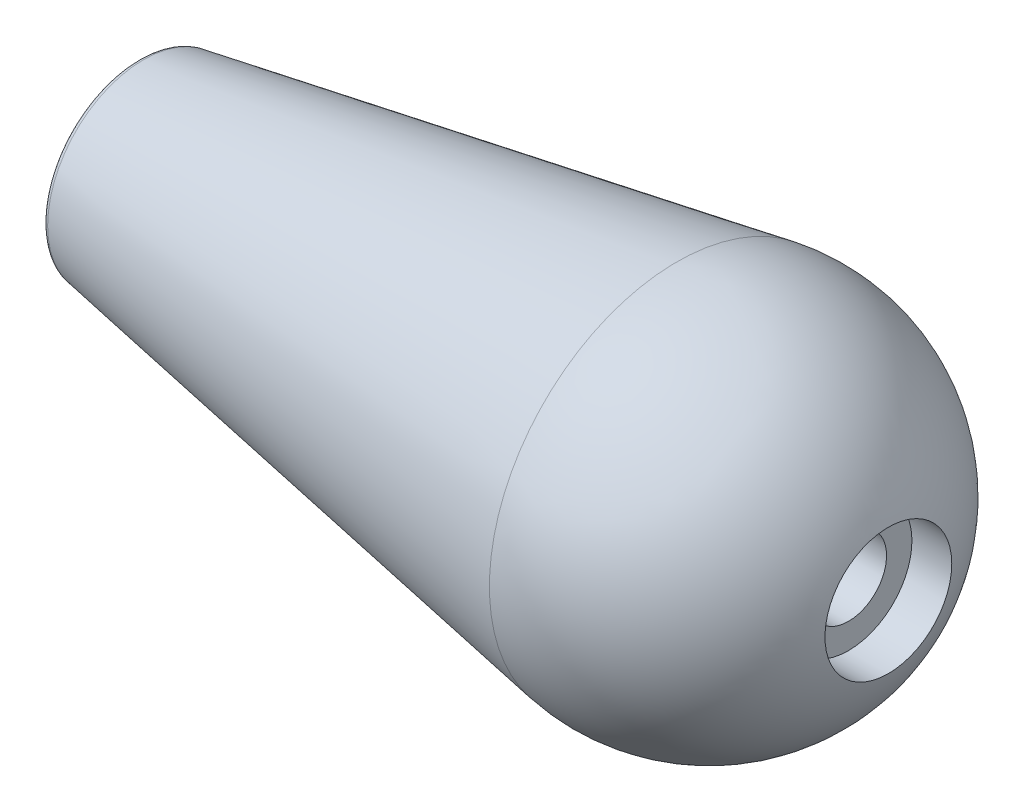
ISO-10303-21;
HEADER;
FILE_DESCRIPTION(('STEP AP214'),'2;1');
FILE_NAME('part.step','',(''),(''),'','','');
FILE_SCHEMA(('AUTOMOTIVE_DESIGN { 1 0 10303 214 1 1 1 1 }'));
ENDSEC;
DATA;
#1=APPLICATION_CONTEXT('core data for automotive mechanical design processes');
#2=APPLICATION_PROTOCOL_DEFINITION('international standard','automotive_design',2000,#1);
#3=PRODUCT_CONTEXT('',#1,'mechanical');
#4=PRODUCT('Part','Part','',(#3));
#5=PRODUCT_RELATED_PRODUCT_CATEGORY('part','',(#4));
#6=PRODUCT_DEFINITION_FORMATION('','',#4);
#7=PRODUCT_DEFINITION_CONTEXT('part definition',#1,'design');
#8=PRODUCT_DEFINITION('design','',#6,#7);
#9=PRODUCT_DEFINITION_SHAPE('','',#8);
#10=(LENGTH_UNIT() NAMED_UNIT(*) SI_UNIT(.MILLI.,.METRE.));
#11=(NAMED_UNIT(*) PLANE_ANGLE_UNIT() SI_UNIT($,.RADIAN.));
#12=(NAMED_UNIT(*) SI_UNIT($,.STERADIAN.) SOLID_ANGLE_UNIT());
#13=UNCERTAINTY_MEASURE_WITH_UNIT(LENGTH_MEASURE(1.E-05),#10,'distance_accuracy_value','');
#14=(GEOMETRIC_REPRESENTATION_CONTEXT(3) GLOBAL_UNCERTAINTY_ASSIGNED_CONTEXT((#13)) GLOBAL_UNIT_ASSIGNED_CONTEXT((#10,
#11,#12)) REPRESENTATION_CONTEXT('',''));
#15=CARTESIAN_POINT('',(0.,0.,0.));
#16=DIRECTION('',(0.,0.,1.));
#17=DIRECTION('',(1.,0.,0.));
#18=AXIS2_PLACEMENT_3D('',#15,#16,#17);
#19=CARTESIAN_POINT('',(90.,0.,0.));
#20=DIRECTION('',(-1.,0.,0.));
#21=DIRECTION('',(0.,0.,-1.));
#22=AXIS2_PLACEMENT_3D('',#19,#20,#21);
#23=SPHERICAL_SURFACE('',#22,30.);
#24=CARTESIAN_POINT('',(84.9280237674633,0.,0.));
#25=DIRECTION('',(-1.,0.,0.));
#26=DIRECTION('',(0.,0.,1.));
#27=AXIS2_PLACEMENT_3D('',#24,#25,#26);
#28=CIRCLE('',#27,29.5681426047796);
#29=CARTESIAN_POINT('',(84.9280237674633,0.,-29.5681426047796));
#30=VERTEX_POINT('',#29);
#31=EDGE_CURVE('E50',#30,#30,#28,.T.);
#32=CARTESIAN_POINT('',(118.284271247462,0.,0.));
#33=DIRECTION('',(-1.,0.,0.));
#34=DIRECTION('',(0.,-1.,0.));
#35=AXIS2_PLACEMENT_3D('',#32,#33,#34);
#36=CIRCLE('',#35,10.);
#37=CARTESIAN_POINT('',(118.284271247462,0.,-10.));
#38=VERTEX_POINT('',#37);
#39=EDGE_CURVE('E55',#38,#38,#36,.F.);
#40=CARTESIAN_POINT('',(84.9280237674633,0.,-29.5681426047796));
#41=CARTESIAN_POINT('',(85.3594841122191,0.,-29.6421599104759));
#42=CARTESIAN_POINT('',(85.7925661105086,0.,-29.7067204924739));
#43=CARTESIAN_POINT('',(86.6611399625244,0.,-29.8168332318109));
#44=CARTESIAN_POINT('',(87.0966318162508,0.,-29.8623853891499));
#45=CARTESIAN_POINT('',(87.9691919275101,0.,-29.9343863019068));
#46=CARTESIAN_POINT('',(88.406260185043,0.,-29.9608350573247));
#47=CARTESIAN_POINT('',(89.2811353945705,0.,-29.9945805512324));
#48=CARTESIAN_POINT('',(89.718942346565,0.,-30.0018772897223));
#49=CARTESIAN_POINT('',(90.5944561518059,0.,-29.9973042162051));
#50=CARTESIAN_POINT('',(91.0321630050521,0.,-29.9854344041979));
#51=CARTESIAN_POINT('',(91.9066379225519,0.,-29.9425511209965));
#52=CARTESIAN_POINT('',(92.3434059868053,0.,-29.9115376498024));
#53=CARTESIAN_POINT('',(93.2151664586505,0.,-29.8304264321444));
#54=CARTESIAN_POINT('',(93.6501588662421,0.,-29.7803286856806));
#55=CARTESIAN_POINT('',(94.517534552977,0.,-29.6611449182741));
#56=CARTESIAN_POINT('',(94.9499178321202,0.,-29.5920588973314));
#57=CARTESIAN_POINT('',(95.8112467911206,0.,-29.4350309509028));
#58=CARTESIAN_POINT('',(96.2401924709778,0.,-29.347089025417));
#59=CARTESIAN_POINT('',(97.0938243467481,0.,-29.1525177724462));
#60=CARTESIAN_POINT('',(97.5185105426613,0.,-29.0458884449612));
#61=CARTESIAN_POINT('',(98.3628097274244,0.,-28.8141466957036));
#62=CARTESIAN_POINT('',(98.7824227162743,0.,-28.6890342739311));
#63=CARTESIAN_POINT('',(99.6157714843147,0.,-28.4205660587399));
#64=CARTESIAN_POINT('',(100.029507263505,0.,-28.2772102653212));
#65=CARTESIAN_POINT('',(100.850308870711,0.,-27.9725299847575));
#66=CARTESIAN_POINT('',(101.257374698726,0.,-27.8112054976125));
#67=CARTESIAN_POINT('',(102.064056442073,0.,-27.4708969365839));
#68=CARTESIAN_POINT('',(102.463672357404,0.,-27.2919128627002));
#69=CARTESIAN_POINT('',(103.254688588335,0.,-26.9166280719597));
#70=CARTESIAN_POINT('',(103.646088903934,0.,-26.7203273551028));
#71=CARTESIAN_POINT('',(104.419923989916,0.,-26.310785401865));
#72=CARTESIAN_POINT('',(104.802358760297,0.,-26.097544165484));
#73=CARTESIAN_POINT('',(105.557529988855,0.,-25.6545297556555));
#74=CARTESIAN_POINT('',(105.930266447031,0.,-25.4247565822078));
#75=CARTESIAN_POINT('',(106.665326866715,0.,-24.9491185568444));
#76=CARTESIAN_POINT('',(107.027650828223,0.,-24.7032537049285));
#77=CARTESIAN_POINT('',(107.741192021047,0.,-24.1959034138072));
#78=CARTESIAN_POINT('',(108.092409252363,0.,-23.9344179746017));
#79=CARTESIAN_POINT('',(108.783064032416,0.,-23.3963275300227));
#80=CARTESIAN_POINT('',(109.122501581153,0.,-23.1197225246492));
#81=CARTESIAN_POINT('',(109.788946614204,0.,-22.551922938811));
#82=CARTESIAN_POINT('',(110.115954098518,0.,-22.2607283583463));
#83=CARTESIAN_POINT('',(110.756912437612,0.,-21.6643075678738));
#84=CARTESIAN_POINT('',(111.070863292393,0.,-21.3590813578658));
#85=CARTESIAN_POINT('',(111.685106824499,0.,-20.7351821392365));
#86=CARTESIAN_POINT('',(111.985399501824,0.,-20.4165091306152));
#87=CARTESIAN_POINT('',(112.571751301193,0.,-19.7663269106251));
#88=CARTESIAN_POINT('',(112.857810423236,0.,-19.4348176992564));
#89=CARTESIAN_POINT('',(113.415147005617,0.,-18.7595982641747));
#90=CARTESIAN_POINT('',(113.686424465955,0.,-18.4158880404616));
#91=CARTESIAN_POINT('',(114.213677944392,0.,-17.7169251502968));
#92=CARTESIAN_POINT('',(114.469653962492,0.,-17.3616724838452));
#93=CARTESIAN_POINT('',(114.965814081762,0.,-16.6403053887073));
#94=CARTESIAN_POINT('',(115.205998182932,0.,-16.274190960021));
#95=CARTESIAN_POINT('',(115.670114298895,0.,-15.5318018516567));
#96=CARTESIAN_POINT('',(115.894046313687,0.,-15.1555271719787));
#97=CARTESIAN_POINT('',(116.325229051886,0.,-14.3935384696687));
#98=CARTESIAN_POINT('',(116.532479775293,0.,-14.0078244470368));
#99=CARTESIAN_POINT('',(116.929903342965,0.,-13.2276963175202));
#100=CARTESIAN_POINT('',(117.120076187232,0.,-12.8332822106355));
#101=CARTESIAN_POINT('',(117.48297768679,0.,-12.0365088546445));
#102=CARTESIAN_POINT('',(117.655706342081,0.,-11.6341496055381));
#103=CARTESIAN_POINT('',(117.983395700096,0.,-10.8222598122694));
#104=CARTESIAN_POINT('',(118.138356402819,0.,-10.4127292681072));
#105=CARTESIAN_POINT('',(118.284271247462,0.,-10.));
#106=B_SPLINE_CURVE_WITH_KNOTS('',3,(#40,#41,#42,#43,#44,#45,#46,#47,#48,#49,#50,#51,#52,#53,
#54,#55,#56,#57,#58,#59,#60,#61,#62,#63,#64,#65,#66,#67,#68,#69,#70,#71,#72,#73,#74,#75,#76,#77,
#78,#79,#80,#81,#82,#83,#84,#85,#86,#87,#88,#89,#90,#91,#92,#93,#94,#95,#96,#97,#98,#99,#100,
#101,#102,#103,#104,#105),.UNSPECIFIED.,.F.,.F.,(4,2,2,2,2,2,2,2,2,2,2,2,2,2,2,2,2,2,2,2,2,2,2,
2,2,2,2,2,2,2,2,2,4),(0.,1.31318380121513,2.62636760243028,3.93955140364542,5.25273520486056,
6.56591900607571,7.87910280729086,9.192286608506,10.5054704097211,11.8186542109363,
13.1318380121514,14.4450218133666,15.7582056145817,17.0713894157969,18.384573217012,
19.6977570182271,21.0109408194423,22.3241246206574,23.6373084218726,24.9504922230877,
26.2636760243029,27.576859825518,28.8900436267332,30.2032274279483,31.5164112291634,
32.8295950303786,34.1427788315937,35.4559626328089,36.769146434024,38.0823302352392,
39.3955140364543,40.7086978376694,42.0218816388846),.UNSPECIFIED.);
#107=EDGE_CURVE('BSEAM37',#30,#38,#106,.T.);
#108=ORIENTED_EDGE('',*,*,#31,.F.);
#109=ORIENTED_EDGE('',*,*,#39,.F.);
#110=ORIENTED_EDGE('',*,*,#107,.T.);
#111=ORIENTED_EDGE('',*,*,#107,.F.);
#112=EDGE_LOOP('',(#108,#110,#109,#111));
#113=FACE_BOUND('',#112,.T.);
#114=ADVANCED_FACE('F37',(#113),#23,.T.);
#115=CARTESIAN_POINT('',(0.,0.,0.));
#116=DIRECTION('',(1.,0.,0.));
#117=DIRECTION('',(0.,0.,-1.));
#118=AXIS2_PLACEMENT_3D('',#115,#116,#117);
#119=PLANE('',#118);
#120=CARTESIAN_POINT('',(0.,0.,0.));
#121=DIRECTION('',(1.,0.,0.));
#122=DIRECTION('',(0.,0.,-1.));
#123=AXIS2_PLACEMENT_3D('',#120,#121,#122);
#124=CIRCLE('',#123,14.1569296691827);
#125=CARTESIAN_POINT('',(0.,0.,-14.1569296691827));
#126=VERTEX_POINT('',#125);
#127=EDGE_CURVE('E45',#126,#126,#124,.F.);
#128=ORIENTED_EDGE('',*,*,#127,.T.);
#129=EDGE_LOOP('',(#128));
#130=FACE_BOUND('',#129,.T.);
#131=CARTESIAN_POINT('',(0.,0.,0.));
#132=DIRECTION('',(-1.,0.,0.));
#133=DIRECTION('',(0.,-1.,0.));
#134=AXIS2_PLACEMENT_3D('',#131,#132,#133);
#135=CIRCLE('',#134,10.);
#136=CARTESIAN_POINT('',(0.,-10.,0.));
#137=VERTEX_POINT('',#136);
#138=EDGE_CURVE('E60',#137,#137,#135,.T.);
#139=ORIENTED_EDGE('',*,*,#138,.F.);
#140=EDGE_LOOP('',(#139));
#141=FACE_BOUND('',#140,.T.);
#142=ADVANCED_FACE('F100',(#130,#141),#119,.F.);
#143=CARTESIAN_POINT('',(84.9280237674633,0.,0.));
#144=DIRECTION('',(1.,0.,0.));
#145=DIRECTION('',(0.,0.,-1.));
#146=AXIS2_PLACEMENT_3D('',#143,#144,#145);
#147=CONICAL_SURFACE('',#146,29.5681426047796,0.169881822982759);
#148=CARTESIAN_POINT('',(0.830934125582106,0.,0.));
#149=DIRECTION('',(-1.,0.,0.));
#150=DIRECTION('',(0.,0.,1.));
#151=AXIS2_PLACEMENT_3D('',#148,#149,#150);
#152=CIRCLE('',#151,15.1425344226754);
#153=CARTESIAN_POINT('',(0.830934125582106,0.,15.1425344226754));
#154=VERTEX_POINT('',#153);
#155=EDGE_CURVE('E10',#154,#154,#152,.F.);
#156=ORIENTED_EDGE('',*,*,#155,.T.);
#157=EDGE_LOOP('',(#156));
#158=FACE_BOUND('',#157,.T.);
#159=ORIENTED_EDGE('',*,*,#31,.T.);
#160=EDGE_LOOP('',(#159));
#161=FACE_BOUND('',#160,.T.);
#162=ADVANCED_FACE('F106',(#158,#161),#147,.T.);
#163=CARTESIAN_POINT('',(0.,0.,0.));
#164=DIRECTION('',(-1.,0.,0.));
#165=DIRECTION('',(0.,-1.,0.));
#166=AXIS2_PLACEMENT_3D('',#163,#164,#165);
#167=CYLINDRICAL_SURFACE('',#166,10.);
#168=CARTESIAN_POINT('',(112.,0.,0.));
#169=DIRECTION('',(-1.,0.,0.));
#170=DIRECTION('',(0.,-1.,0.));
#171=AXIS2_PLACEMENT_3D('',#168,#169,#170);
#172=CIRCLE('',#171,10.);
#173=CARTESIAN_POINT('',(112.,-10.,0.));
#174=VERTEX_POINT('',#173);
#175=EDGE_CURVE('E77',#174,#174,#172,.T.);
#176=ORIENTED_EDGE('',*,*,#175,.T.);
#177=EDGE_LOOP('',(#176));
#178=FACE_BOUND('',#177,.T.);
#179=ORIENTED_EDGE('',*,*,#39,.T.);
#180=EDGE_LOOP('',(#179));
#181=FACE_BOUND('',#180,.T.);
#182=ADVANCED_FACE('F82',(#178,#181),#167,.F.);
#183=CARTESIAN_POINT('',(0.,0.,0.));
#184=DIRECTION('',(-1.,0.,0.));
#185=DIRECTION('',(0.,-1.,0.));
#186=AXIS2_PLACEMENT_3D('',#183,#184,#185);
#187=CYLINDRICAL_SURFACE('',#186,10.);
#188=ORIENTED_EDGE('',*,*,#138,.T.);
#189=EDGE_LOOP('',(#188));
#190=FACE_BOUND('',#189,.T.);
#191=CARTESIAN_POINT('',(8.,0.,0.));
#192=DIRECTION('',(-1.,0.,0.));
#193=DIRECTION('',(0.,-1.,0.));
#194=AXIS2_PLACEMENT_3D('',#191,#192,#193);
#195=CIRCLE('',#194,10.);
#196=CARTESIAN_POINT('',(8.,-10.,0.));
#197=VERTEX_POINT('',#196);
#198=EDGE_CURVE('E65',#197,#197,#195,.T.);
#199=ORIENTED_EDGE('',*,*,#198,.F.);
#200=EDGE_LOOP('',(#199));
#201=FACE_BOUND('',#200,.T.);
#202=ADVANCED_FACE('F112',(#190,#201),#187,.F.);
#203=CARTESIAN_POINT('',(8.,10.,0.));
#204=DIRECTION('',(-1.,0.,0.));
#205=DIRECTION('',(0.,-1.,0.));
#206=AXIS2_PLACEMENT_3D('',#203,#204,#205);
#207=PLANE('',#206);
#208=ORIENTED_EDGE('',*,*,#198,.T.);
#209=EDGE_LOOP('',(#208));
#210=FACE_BOUND('',#209,.T.);
#211=CARTESIAN_POINT('',(8.,0.,0.));
#212=DIRECTION('',(-1.,0.,0.));
#213=DIRECTION('',(0.,-1.,0.));
#214=AXIS2_PLACEMENT_3D('',#211,#212,#213);
#215=CIRCLE('',#214,6.);
#216=CARTESIAN_POINT('',(8.,-6.,0.));
#217=VERTEX_POINT('',#216);
#218=EDGE_CURVE('E69',#217,#217,#215,.T.);
#219=ORIENTED_EDGE('',*,*,#218,.F.);
#220=EDGE_LOOP('',(#219));
#221=FACE_BOUND('',#220,.T.);
#222=ADVANCED_FACE('F95',(#210,#221),#207,.T.);
#223=CARTESIAN_POINT('',(0.,0.,0.));
#224=DIRECTION('',(-1.,0.,0.));
#225=DIRECTION('',(0.,-1.,0.));
#226=AXIS2_PLACEMENT_3D('',#223,#224,#225);
#227=CYLINDRICAL_SURFACE('',#226,6.00000000000001);
#228=ORIENTED_EDGE('',*,*,#218,.T.);
#229=EDGE_LOOP('',(#228));
#230=FACE_BOUND('',#229,.T.);
#231=CARTESIAN_POINT('',(112.,0.,0.));
#232=DIRECTION('',(-1.,0.,0.));
#233=DIRECTION('',(0.,-1.,0.));
#234=AXIS2_PLACEMENT_3D('',#231,#232,#233);
#235=CIRCLE('',#234,6.00000000000002);
#236=CARTESIAN_POINT('',(112.,-6.00000000000005,0.));
#237=VERTEX_POINT('',#236);
#238=EDGE_CURVE('E73',#237,#237,#235,.T.);
#239=ORIENTED_EDGE('',*,*,#238,.F.);
#240=EDGE_LOOP('',(#239));
#241=FACE_BOUND('',#240,.T.);
#242=ADVANCED_FACE('F87',(#230,#241),#227,.F.);
#243=CARTESIAN_POINT('',(112.,10.,0.));
#244=DIRECTION('',(1.,0.,0.));
#245=DIRECTION('',(0.,1.,0.));
#246=AXIS2_PLACEMENT_3D('',#243,#244,#245);
#247=PLANE('',#246);
#248=ORIENTED_EDGE('',*,*,#238,.T.);
#249=EDGE_LOOP('',(#248));
#250=FACE_BOUND('',#249,.T.);
#251=ORIENTED_EDGE('',*,*,#175,.F.);
#252=EDGE_LOOP('',(#251));
#253=FACE_BOUND('',#252,.T.);
#254=ADVANCED_FACE('F85',(#250,#253),#247,.T.);
#255=CARTESIAN_POINT('',(1.,0.,0.));
#256=DIRECTION('',(1.,0.,0.));
#257=DIRECTION('',(0.,0.,-1.));
#258=AXIS2_PLACEMENT_3D('',#255,#256,#257);
#259=TOROIDAL_SURFACE('',#258,14.1569296691827,1.);
#260=ORIENTED_EDGE('',*,*,#155,.F.);
#261=EDGE_LOOP('',(#260));
#262=FACE_BOUND('',#261,.T.);
#263=ORIENTED_EDGE('',*,*,#127,.F.);
#264=EDGE_LOOP('',(#263));
#265=FACE_BOUND('',#264,.T.);
#266=ADVANCED_FACE('F39',(#262,#265),#259,.T.);
#267=CLOSED_SHELL('',(#114,#142,#162,#182,#202,#222,#242,#254,#266));
#268=MANIFOLD_SOLID_BREP('B2',#267);
#269=ADVANCED_BREP_SHAPE_REPRESENTATION('',(#18,#268),#14);
#270=SHAPE_DEFINITION_REPRESENTATION(#9,#269);
ENDSEC;
END-ISO-10303-21;
